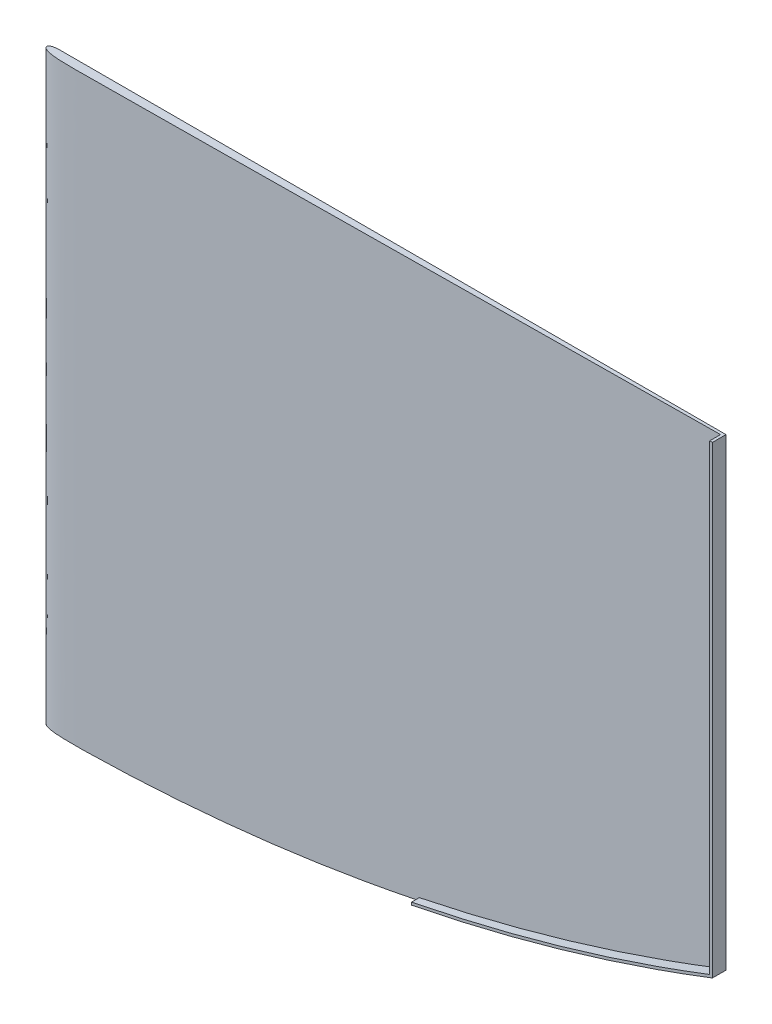
ISO-10303-21;
HEADER;
FILE_DESCRIPTION(('STEP AP214'),'2;1');
FILE_NAME('part.step','',(''),(''),'','','');
FILE_SCHEMA(('AUTOMOTIVE_DESIGN { 1 0 10303 214 1 1 1 1 }'));
ENDSEC;
DATA;
#1=APPLICATION_CONTEXT('core data for automotive mechanical design processes');
#2=APPLICATION_PROTOCOL_DEFINITION('international standard','automotive_design',2000,#1);
#3=PRODUCT_CONTEXT('',#1,'mechanical');
#4=PRODUCT('Part','Part','',(#3));
#5=PRODUCT_RELATED_PRODUCT_CATEGORY('part','',(#4));
#6=PRODUCT_DEFINITION_FORMATION('','',#4);
#7=PRODUCT_DEFINITION_CONTEXT('part definition',#1,'design');
#8=PRODUCT_DEFINITION('design','',#6,#7);
#9=PRODUCT_DEFINITION_SHAPE('','',#8);
#10=(LENGTH_UNIT() NAMED_UNIT(*) SI_UNIT(.MILLI.,.METRE.));
#11=(NAMED_UNIT(*) PLANE_ANGLE_UNIT() SI_UNIT($,.RADIAN.));
#12=(NAMED_UNIT(*) SI_UNIT($,.STERADIAN.) SOLID_ANGLE_UNIT());
#13=UNCERTAINTY_MEASURE_WITH_UNIT(LENGTH_MEASURE(1.E-05),#10,'distance_accuracy_value','');
#14=(GEOMETRIC_REPRESENTATION_CONTEXT(3) GLOBAL_UNCERTAINTY_ASSIGNED_CONTEXT((#13)) GLOBAL_UNIT_ASSIGNED_CONTEXT((#10,
#11,#12)) REPRESENTATION_CONTEXT('',''));
#15=CARTESIAN_POINT('',(0.,0.,0.));
#16=DIRECTION('',(0.,0.,1.));
#17=DIRECTION('',(1.,0.,0.));
#18=AXIS2_PLACEMENT_3D('',#15,#16,#17);
#19=CARTESIAN_POINT('',(10.,325.,0.46764330691438));
#20=CARTESIAN_POINT('',(2.71621760884499,325.,0.46764330691438));
#21=CARTESIAN_POINT('',(-3.97735864607499,325.,4.21726246693246));
#22=CARTESIAN_POINT('',(9.87652859379078,325.,12.2675568358497));
#23=CARTESIAN_POINT('',(65.8357509453584,325.,10.4516996092771));
#24=CARTESIAN_POINT('',(750.000000000002,325.,3.46764330691435));
#25=B_SPLINE_CURVE_WITH_KNOTS('',3,(#19,#20,#21,#22,#23,#24),.UNSPECIFIED.,.F.,.F.,(4,1,1,4),
(0.,0.344535257627006,0.623371844664344,1.),.UNSPECIFIED.);
#26=DIRECTION('',(0.,-1.,0.));
#27=VECTOR('',#26,1.);
#28=SURFACE_OF_LINEAR_EXTRUSION('',#25,#27);
#29=CARTESIAN_POINT('',(415.998579588873,-284.00921309762,6.93854722127019));
#30=CARTESIAN_POINT('',(425.417813856949,-282.144036478102,6.83885819219785));
#31=CARTESIAN_POINT('',(434.823488249002,-280.210376323182,6.73946279469724));
#32=CARTESIAN_POINT('',(453.596060987363,-276.208698371215,6.54138539036173));
#33=CARTESIAN_POINT('',(462.962989353129,-274.140821432531,6.44270275264504));
#34=CARTESIAN_POINT('',(481.658190886952,-269.871219995788,6.24605184077392));
#35=CARTESIAN_POINT('',(490.986489512008,-267.669606985595,6.14808304581763));
#36=CARTESIAN_POINT('',(509.604560268319,-263.133071755132,5.95285563578745));
#37=CARTESIAN_POINT('',(518.894352517353,-260.798232112461,5.85559662204917));
#38=CARTESIAN_POINT('',(537.435537483736,-255.99577139029,5.66178259815729));
#39=CARTESIAN_POINT('',(546.686944244422,-253.528204536924,5.56522731852563));
#40=CARTESIAN_POINT('',(565.151486006363,-248.460816921244,5.37281287232848));
#41=CARTESIAN_POINT('',(574.364628275589,-245.86102264551,5.27695357071304));
#42=CARTESIAN_POINT('',(592.752523606552,-240.529775721392,5.08592473015274));
#43=CARTESIAN_POINT('',(601.927277517865,-237.798326003615,4.99075517590852));
#44=CARTESIAN_POINT('',(620.238814163587,-232.204213208082,4.80109325479693));
#45=CARTESIAN_POINT('',(629.375588486929,-229.341522594885,4.70660103489334));
#46=CARTESIAN_POINT('',(647.611334774014,-223.485431981114,4.51828345693297));
#47=CARTESIAN_POINT('',(656.710289496438,-220.491978286409,4.42445839156537));
#48=CARTESIAN_POINT('',(674.870565916466,-214.374862068707,4.23746463146588));
#49=CARTESIAN_POINT('',(683.931860997545,-211.251120519769,4.14429637637516));
#50=CARTESIAN_POINT('',(702.016981757264,-204.873918796261,3.95860578360579));
#51=CARTESIAN_POINT('',(711.040770942007,-201.620355124789,3.86608403328144));
#52=CARTESIAN_POINT('',(729.051060930541,-194.984014928669,3.68167589574503));
#53=CARTESIAN_POINT('',(738.037514929501,-191.60111135411,3.58979024371872));
#54=CARTESIAN_POINT('',(747.000000032674,-188.155881964508,3.49827236585017));
#55=B_SPLINE_CURVE_WITH_KNOTS('',3,(#29,#30,#31,#32,#33,#34,#35,#36,#37,#38,#39,#40,#41,#42,#43,
#44,#45,#46,#47,#48,#49,#50,#51,#52,#53,#54),.UNSPECIFIED.,.F.,.F.,(4,2,2,2,2,2,2,2,2,2,2,2,4),
(0.,28.8076790939159,57.5855991200083,86.3398494503766,115.076466711799,143.801431415189,
172.520664687382,201.239258973596,229.963906485863,258.700461915227,287.454708429981,
316.232355299303,345.039035654405),.UNSPECIFIED.);
#56=CARTESIAN_POINT('',(415.998579588873,-284.00921309762,6.93854722127019));
#57=VERTEX_POINT('',#56);
#58=CARTESIAN_POINT('',(747.000000000002,-188.155881959906,3.49827236618377));
#59=VERTEX_POINT('',#58);
#60=EDGE_CURVE('E123',#57,#59,#55,.T.);
#61=ORIENTED_EDGE('',*,*,#60,.T.);
#62=DIRECTION('',(0.,-1.,0.));
#63=VECTOR('',#62,1.);
#64=CARTESIAN_POINT('',(747.000000000002,325.,3.49827236618377));
#65=LINE('',#64,#63);
#66=CARTESIAN_POINT('',(746.999999988106,325.,3.49827236630525));
#67=VERTEX_POINT('',#66);
#68=EDGE_CURVE('E54',#67,#59,#65,.T.);
#69=ORIENTED_EDGE('',*,*,#68,.F.);
#70=CARTESIAN_POINT('',(10.,325.,0.46764330691438));
#71=VERTEX_POINT('',#70);
#72=EDGE_CURVE('E279',#71,#67,#25,.T.);
#73=ORIENTED_EDGE('',*,*,#72,.F.);
#74=DIRECTION('',(0.,-1.,0.));
#75=VECTOR('',#74,1.);
#76=CARTESIAN_POINT('',(10.,325.,0.46764330691438));
#77=LINE('',#76,#75);
#78=CARTESIAN_POINT('',(10.,-325.,0.46764330691438));
#79=VERTEX_POINT('',#78);
#80=EDGE_CURVE('E285',#71,#79,#77,.T.);
#81=ORIENTED_EDGE('',*,*,#80,.T.);
#82=CARTESIAN_POINT('',(10.,-325.,0.46764330691438));
#83=CARTESIAN_POINT('',(2.71621760884499,-325.,0.46764330691438));
#84=CARTESIAN_POINT('',(-3.97735864607499,-325.,4.21726246693246));
#85=CARTESIAN_POINT('',(9.87652859379078,-325.,12.2675568358497));
#86=CARTESIAN_POINT('',(65.8357509453584,-325.,10.4516996092771));
#87=CARTESIAN_POINT('',(750.000000000002,-325.,3.46764330691435));
#88=B_SPLINE_CURVE_WITH_KNOTS('',3,(#82,#83,#84,#85,#86,#87),.UNSPECIFIED.,.F.,.F.,(4,1,1,4),
(0.,0.344535257627006,0.623371844664344,1.),.UNSPECIFIED.);
#89=CARTESIAN_POINT('',(-0.15614988924536,-325.,4.23056836880614));
#90=VERTEX_POINT('',#89);
#91=EDGE_CURVE('E293',#79,#90,#88,.T.);
#92=ORIENTED_EDGE('',*,*,#91,.T.);
#93=CARTESIAN_POINT('',(46.9250112812236,-325.,10.6638063402243));
#94=VERTEX_POINT('',#93);
#95=EDGE_CURVE('E292',#90,#94,#88,.T.);
#96=ORIENTED_EDGE('',*,*,#95,.T.);
#97=CARTESIAN_POINT('',(46.9250112714861,-325.,10.6638063402571));
#98=CARTESIAN_POINT('',(48.4920286301361,-324.982394340852,10.6584804391421));
#99=CARTESIAN_POINT('',(50.0590214489743,-324.963023181662,10.6519767038865));
#100=CARTESIAN_POINT('',(53.1929498190023,-324.920745643987,10.6370975558704));
#101=CARTESIAN_POINT('',(54.7598853702205,-324.897839267273,10.6287221440474));
#102=CARTESIAN_POINT('',(57.8936441543706,-324.848487820439,10.6105839076951));
#103=CARTESIAN_POINT('',(59.4604673892772,-324.822042859722,10.6008211260583));
#104=CARTESIAN_POINT('',(62.5940427065563,-324.765609548289,10.5801984325904));
#105=CARTESIAN_POINT('',(64.1607947889183,-324.735621197056,10.5693385205988));
#106=CARTESIAN_POINT('',(68.8608726628726,-324.640336102925,10.5354624299445));
#107=CARTESIAN_POINT('',(71.9940829570532,-324.569718329751,10.5111495128503));
#108=CARTESIAN_POINT('',(78.2601009352993,-324.414261857464,10.4602228626428));
#109=CARTESIAN_POINT('',(81.3929086228833,-324.329423292474,10.4336091512305));
#110=CARTESIAN_POINT('',(87.6589161744335,-324.14546938409,10.3787474800697));
#111=CARTESIAN_POINT('',(90.792115924606,-324.046350289019,10.3504990920415));
#112=CARTESIAN_POINT('',(97.0580503481367,-323.833820855273,10.2928167857794));
#113=CARTESIAN_POINT('',(100.190785016626,-323.720410376265,10.2633828559062));
#114=CARTESIAN_POINT('',(106.455755681653,-323.479267482667,10.2036274383392));
#115=CARTESIAN_POINT('',(109.587991667412,-323.351534791999,10.1733059335446));
#116=CARTESIAN_POINT('',(115.851927280637,-323.081717548398,10.1119846306839));
#117=CARTESIAN_POINT('',(118.983626890054,-322.93963258219,10.0809848131059));
#118=CARTESIAN_POINT('',(127.140259700305,-322.550802463804,9.99955728544947));
#119=CARTESIAN_POINT('',(132.164654653636,-322.292732638489,9.94871920660107));
#120=CARTESIAN_POINT('',(142.211395775251,-321.739463247906,9.84613639037336));
#121=CARTESIAN_POINT('',(147.233741935393,-321.4442635365,9.79439164942619));
#122=CARTESIAN_POINT('',(162.298128731967,-320.502767494516,9.6382321021987));
#123=CARTESIAN_POINT('',(172.336731077416,-319.800611717719,9.53289992676615));
#124=CARTESIAN_POINT('',(192.402835557896,-318.246629955968,9.32112610038324));
#125=CARTESIAN_POINT('',(202.430337068085,-317.394795938077,9.21468439017489));
#126=CARTESIAN_POINT('',(222.471696613436,-315.540900977592,9.00136572654751));
#127=CARTESIAN_POINT('',(232.485554315508,-314.538836431428,8.89448876274793));
#128=CARTESIAN_POINT('',(252.49702277609,-312.384073502198,8.68070408220104));
#129=CARTESIAN_POINT('',(262.494633577527,-311.231375517786,8.57379636553586));
#130=CARTESIAN_POINT('',(282.475727070061,-308.774509513552,8.36014649122991));
#131=CARTESIAN_POINT('',(292.459201542678,-307.470274633736,8.25340442788633));
#132=CARTESIAN_POINT('',(312.405043654994,-304.710619275397,8.04029443508885));
#133=CARTESIAN_POINT('',(322.367411695664,-303.255201695739,7.93392649850164));
#134=CARTESIAN_POINT('',(342.26877702119,-300.193164699446,7.72167084571377));
#135=CARTESIAN_POINT('',(352.207774565931,-298.586546972413,7.61578312416075));
#136=CARTESIAN_POINT('',(372.060153738323,-295.222227476892,7.40456177983898));
#137=CARTESIAN_POINT('',(381.973535410381,-293.464525970502,7.29922815610934));
#138=CARTESIAN_POINT('',(401.77246698976,-289.798288752117,7.08916799315594));
#139=CARTESIAN_POINT('',(411.658016660442,-287.889751761647,6.98444145908593));
#140=CARTESIAN_POINT('',(430.858268182498,-284.030922285169,6.78135510208745));
#141=CARTESIAN_POINT('',(440.174580951991,-282.088641990211,6.68296073021432));
#142=CARTESIAN_POINT('',(458.778487600473,-278.070114637262,6.48677545711067));
#143=CARTESIAN_POINT('',(468.066080861296,-275.99386471642,6.38898456882517));
#144=CARTESIAN_POINT('',(486.610642724918,-271.707962668568,6.19402752431056));
#145=CARTESIAN_POINT('',(495.867610690528,-269.498307784126,6.09686138104067));
#146=CARTESIAN_POINT('',(514.349050294268,-264.946269300759,5.9031712137308));
#147=CARTESIAN_POINT('',(523.57352130084,-262.60388313724,5.8066472021382));
#148=CARTESIAN_POINT('',(541.988120361369,-257.787165322885,5.61425597671273));
#149=CARTESIAN_POINT('',(551.178247836472,-255.312831458731,5.51838877392777));
#150=CARTESIAN_POINT('',(569.522340504526,-250.233110205487,5.32732384146464));
#151=CARTESIAN_POINT('',(578.67630524452,-247.627721180445,5.23212612016048));
#152=CARTESIAN_POINT('',(596.945933309525,-242.286990904278,5.04241495265604));
#153=CARTESIAN_POINT('',(606.061597850404,-239.551653812904,4.94790148466369));
#154=CARTESIAN_POINT('',(624.253203052854,-233.952045159938,4.75956534517915));
#155=CARTESIAN_POINT('',(633.329143875659,-231.087774122209,4.66574267088204));
#156=CARTESIAN_POINT('',(651.439590986535,-225.231501904938,4.47879711169587));
#157=CARTESIAN_POINT('',(660.474097831903,-222.239502448988,4.38567421738378));
#158=CARTESIAN_POINT('',(678.500001871966,-216.129080250428,4.20013650207328));
#159=CARTESIAN_POINT('',(687.49140017075,-213.010660765221,4.10772166290363));
#160=CARTESIAN_POINT('',(705.429441010396,-206.64879979047,3.92360784642852));
#161=CARTESIAN_POINT('',(714.376085385429,-203.405363472777,3.83190883969794));
#162=CARTESIAN_POINT('',(732.223023250498,-196.794987939816,3.64923386795035));
#163=CARTESIAN_POINT('',(741.123319520033,-193.428056230292,3.55825785939884));
#164=CARTESIAN_POINT('',(750.000000000002,-190.,3.46764330691435));
#165=B_SPLINE_CURVE_WITH_KNOTS('',3,(#97,#98,#99,#100,#101,#102,#103,#104,#105,#106,#107,#108,
#109,#110,#111,#112,#113,#114,#115,#116,#117,#118,#119,#120,#121,#122,#123,#124,#125,#126,#127,
#128,#129,#130,#131,#132,#133,#134,#135,#136,#137,#138,#139,#140,#141,#142,#143,#144,#145,#146,
#147,#148,#149,#150,#151,#152,#153,#154,#155,#156,#157,#158,#159,#160,#161,#162,#163,#164),
.UNSPECIFIED.,.F.,.F.,(4,2,2,2,2,2,2,2,2,2,2,2,2,2,2,2,2,2,2,2,2,2,2,2,2,2,2,2,2,2,2,2,2,4),(0.,
4.70137345582646,9.40274455682551,14.1039703401984,18.8051968109248,28.2074611001891,
37.6096367175894,47.0142869255293,56.4190294891209,65.8239533714358,75.2291481463976,
90.3228197325352,105.416550727582,135.606375102656,165.797820201451,195.989989616306,
226.182079128585,256.387540723112,286.592423247561,316.796968284754,347.001460924952,
377.206209604779,405.756631772842,434.307664248365,462.859287065645,491.411461737246,
519.964115499313,548.517125770562,577.06922265048,605.621203532963,634.172799251245,
662.723659761596,691.273340409914,719.821288745137),.UNSPECIFIED.);
#166=CARTESIAN_POINT('',(415.998579589069,-287.009213099258,6.93854722126815));
#167=VERTEX_POINT('',#166);
#168=EDGE_CURVE('E221',#94,#167,#165,.T.);
#169=ORIENTED_EDGE('',*,*,#168,.T.);
#170=DIRECTION('',(0.,-1.,0.));
#171=VECTOR('',#170,1.);
#172=CARTESIAN_POINT('',(415.99857958887,325.,6.93854722127023));
#173=LINE('',#172,#171);
#174=EDGE_CURVE('E209',#57,#167,#173,.T.);
#175=ORIENTED_EDGE('',*,*,#174,.F.);
#176=EDGE_LOOP('',(#61,#69,#73,#81,#92,#96,#169,#175));
#177=FACE_BOUND('',#176,.T.);
#178=ADVANCED_FACE('F37',(#177),#28,.F.);
#179=CARTESIAN_POINT('',(747.000000000002,325.,0.465643306914379));
#180=DIRECTION('',(-1.,0.,0.));
#181=DIRECTION('',(0.,-1.,0.));
#182=AXIS2_PLACEMENT_3D('',#179,#180,#181);
#183=PLANE('',#182);
#184=ORIENTED_EDGE('',*,*,#68,.T.);
#185=DIRECTION('',(0.,0.,1.));
#186=VECTOR('',#185,1.);
#187=CARTESIAN_POINT('',(747.000000044554,-188.155881959905,-25.2653474565868));
#188=LINE('',#187,#186);
#189=CARTESIAN_POINT('',(747.000000044554,-188.155881959905,15.4676433069144));
#190=VERTEX_POINT('',#189);
#191=EDGE_CURVE('E128',#59,#190,#188,.T.);
#192=ORIENTED_EDGE('',*,*,#191,.T.);
#193=DIRECTION('',(0.,-1.,0.));
#194=VECTOR('',#193,1.);
#195=CARTESIAN_POINT('',(747.000000000002,325.,15.4676433069144));
#196=LINE('',#195,#194);
#197=CARTESIAN_POINT('',(747.000000000002,325.,15.4676433069144));
#198=VERTEX_POINT('',#197);
#199=EDGE_CURVE('E138',#198,#190,#196,.T.);
#200=ORIENTED_EDGE('',*,*,#199,.F.);
#201=DIRECTION('',(0.,0.,1.));
#202=VECTOR('',#201,1.);
#203=CARTESIAN_POINT('',(747.000000000002,325.,0.465643306914379));
#204=LINE('',#203,#202);
#205=EDGE_CURVE('E218',#67,#198,#204,.T.);
#206=ORIENTED_EDGE('',*,*,#205,.F.);
#207=EDGE_LOOP('',(#184,#192,#200,#206));
#208=FACE_BOUND('',#207,.T.);
#209=ADVANCED_FACE('F217',(#208),#183,.T.);
#210=CARTESIAN_POINT('',(750.,325.,0.46764330691438));
#211=DIRECTION('',(-1.,0.,0.));
#212=DIRECTION('',(0.,0.,1.));
#213=AXIS2_PLACEMENT_3D('',#210,#211,#212);
#214=PLANE('',#213);
#215=DIRECTION('',(0.,0.,-1.));
#216=VECTOR('',#215,1.);
#217=CARTESIAN_POINT('',(750.,325.,0.46764330691438));
#218=LINE('',#217,#216);
#219=CARTESIAN_POINT('',(750.000000000002,325.,15.4676433069144));
#220=VERTEX_POINT('',#219);
#221=CARTESIAN_POINT('',(750.,325.,0.46764330691438));
#222=VERTEX_POINT('',#221);
#223=EDGE_CURVE('E298',#220,#222,#218,.T.);
#224=ORIENTED_EDGE('',*,*,#223,.F.);
#225=DIRECTION('',(0.,-1.,0.));
#226=VECTOR('',#225,1.);
#227=CARTESIAN_POINT('',(750.000000000002,325.,15.4676433069144));
#228=LINE('',#227,#226);
#229=CARTESIAN_POINT('',(750.000000000002,-190.,15.4676433069144));
#230=VERTEX_POINT('',#229);
#231=EDGE_CURVE('E419',#220,#230,#228,.T.);
#232=ORIENTED_EDGE('',*,*,#231,.T.);
#233=DIRECTION('',(0.,0.,1.));
#234=VECTOR('',#233,1.);
#235=CARTESIAN_POINT('',(750.000000000002,-190.,0.465643306914379));
#236=LINE('',#235,#234);
#237=CARTESIAN_POINT('',(750.000000000002,-190.,3.46764330691435));
#238=VERTEX_POINT('',#237);
#239=EDGE_CURVE('E417',#238,#230,#236,.T.);
#240=ORIENTED_EDGE('',*,*,#239,.F.);
#241=DIRECTION('',(0.,0.,-1.));
#242=VECTOR('',#241,1.);
#243=CARTESIAN_POINT('',(750.000000000002,-190.,1241.7072502727));
#244=LINE('',#243,#242);
#245=CARTESIAN_POINT('',(750.,-190.,0.46764330691438));
#246=VERTEX_POINT('',#245);
#247=EDGE_CURVE('E62',#238,#246,#244,.T.);
#248=ORIENTED_EDGE('',*,*,#247,.T.);
#249=DIRECTION('',(0.,-1.,0.));
#250=VECTOR('',#249,1.);
#251=CARTESIAN_POINT('',(750.,325.,0.46764330691438));
#252=LINE('',#251,#250);
#253=EDGE_CURVE('E46',#222,#246,#252,.T.);
#254=ORIENTED_EDGE('',*,*,#253,.F.);
#255=EDGE_LOOP('',(#224,#232,#240,#248,#254));
#256=FACE_BOUND('',#255,.T.);
#257=ADVANCED_FACE('F39',(#256),#214,.F.);
#258=CARTESIAN_POINT('',(10.,325.,0.46764330691438));
#259=DIRECTION('',(0.,0.,1.));
#260=DIRECTION('',(1.,0.,0.));
#261=AXIS2_PLACEMENT_3D('',#258,#259,#260);
#262=PLANE('',#261);
#263=ORIENTED_EDGE('',*,*,#253,.T.);
#264=CARTESIAN_POINT('',(-0.156149889245851,-325.,0.4676433069144));
#265=CARTESIAN_POINT('',(389.150571819921,-329.354542083934,0.4676433069144));
#266=CARTESIAN_POINT('',(750.000000000002,-190.,0.4676433069144));
#267=B_SPLINE_CURVE_WITH_KNOTS('',2,(#264,#265,#266),.UNSPECIFIED.,.F.,.F.,(3,3),(0.,1.),.UNSPECIFIED.);
#268=CARTESIAN_POINT('',(46.9250112714985,-325.,0.4676433069144));
#269=VERTEX_POINT('',#268);
#270=EDGE_CURVE('E269',#246,#269,#267,.F.);
#271=ORIENTED_EDGE('',*,*,#270,.T.);
#272=DIRECTION('',(-1.,0.,0.));
#273=VECTOR('',#272,1.);
#274=CARTESIAN_POINT('',(10.,-325.,0.46764330691438));
#275=LINE('',#274,#273);
#276=EDGE_CURVE('E287',#269,#79,#275,.T.);
#277=ORIENTED_EDGE('',*,*,#276,.T.);
#278=ORIENTED_EDGE('',*,*,#80,.F.);
#279=DIRECTION('',(-1.,0.,0.));
#280=VECTOR('',#279,1.);
#281=CARTESIAN_POINT('',(10.,325.,0.46764330691438));
#282=LINE('',#281,#280);
#283=EDGE_CURVE('E286',#222,#71,#282,.T.);
#284=ORIENTED_EDGE('',*,*,#283,.F.);
#285=EDGE_LOOP('',(#263,#271,#277,#278,#284));
#286=FACE_BOUND('',#285,.T.);
#287=ADVANCED_FACE('F278',(#286),#262,.F.);
#288=CARTESIAN_POINT('',(5.13021399082541,325.,8.30029531681887));
#289=DIRECTION('',(0.,-1.,0.));
#290=DIRECTION('',(0.,0.,-1.));
#291=AXIS2_PLACEMENT_3D('',#288,#289,#290);
#292=PLANE('',#291);
#293=ORIENTED_EDGE('',*,*,#223,.T.);
#294=ORIENTED_EDGE('',*,*,#283,.T.);
#295=ORIENTED_EDGE('',*,*,#72,.T.);
#296=ORIENTED_EDGE('',*,*,#205,.T.);
#297=DIRECTION('',(-1.,0.,0.));
#298=VECTOR('',#297,1.);
#299=CARTESIAN_POINT('',(750.000000000002,325.,15.4676433069144));
#300=LINE('',#299,#298);
#301=EDGE_CURVE('E211',#220,#198,#300,.T.);
#302=ORIENTED_EDGE('',*,*,#301,.F.);
#303=EDGE_LOOP('',(#293,#294,#295,#296,#302));
#304=FACE_BOUND('',#303,.T.);
#305=ADVANCED_FACE('F317',(#304),#292,.F.);
#306=CARTESIAN_POINT('',(5.13021399082541,-325.,8.30029531681887));
#307=DIRECTION('',(0.,-1.,0.));
#308=DIRECTION('',(0.,0.,-1.));
#309=AXIS2_PLACEMENT_3D('',#306,#307,#308);
#310=PLANE('',#309);
#311=DIRECTION('',(0.,0.,-1.));
#312=VECTOR('',#311,1.);
#313=CARTESIAN_POINT('',(46.9250112714985,-325.,1241.7072502727));
#314=LINE('',#313,#312);
#315=EDGE_CURVE('E11',#94,#269,#314,.T.);
#316=ORIENTED_EDGE('',*,*,#315,.F.);
#317=ORIENTED_EDGE('',*,*,#95,.F.);
#318=ORIENTED_EDGE('',*,*,#91,.F.);
#319=ORIENTED_EDGE('',*,*,#276,.F.);
#320=EDGE_LOOP('',(#316,#317,#318,#319));
#321=FACE_BOUND('',#320,.T.);
#322=ADVANCED_FACE('F277',(#321),#310,.T.);
#323=CARTESIAN_POINT('',(-0.156149889245851,-325.,1241.7072502727));
#324=CARTESIAN_POINT('',(389.150571819921,-329.354542083934,1241.7072502727));
#325=CARTESIAN_POINT('',(750.000000000002,-190.,1241.7072502727));
#326=B_SPLINE_CURVE_WITH_KNOTS('',2,(#323,#324,#325),.UNSPECIFIED.,.F.,.F.,(3,3),(0.,1.),.UNSPECIFIED.);
#327=DIRECTION('',(0.,0.,-1.));
#328=VECTOR('',#327,1.);
#329=SURFACE_OF_LINEAR_EXTRUSION('',#326,#328);
#330=ORIENTED_EDGE('',*,*,#270,.F.);
#331=ORIENTED_EDGE('',*,*,#247,.F.);
#332=CARTESIAN_POINT('',(745.499631392405,-191.731961137145,3.51359410493061));
#333=CARTESIAN_POINT('',(746.250028601426,-191.444173568415,3.50593048794489));
#334=CARTESIAN_POINT('',(747.000257923236,-191.155949689278,3.498269446284));
#335=CARTESIAN_POINT('',(748.500380792437,-190.57862931019,3.4829525136119));
#336=CARTESIAN_POINT('',(749.250274339827,-190.28953281024,3.47529662260068));
#337=CARTESIAN_POINT('',(750.000000000007,-189.999999999882,3.4676433069143));
#338=B_SPLINE_CURVE_WITH_KNOTS('',3,(#332,#333,#334,#335,#336,#337),.UNSPECIFIED.,.F.,.F.,(4,2,
4),(0.,2.41117846338964,4.82235692677929),.UNSPECIFIED.);
#339=CARTESIAN_POINT('',(747.000000044564,-191.155881959902,3.49827236572882));
#340=VERTEX_POINT('',#339);
#341=EDGE_CURVE('E219',#340,#238,#338,.T.);
#342=ORIENTED_EDGE('',*,*,#341,.F.);
#343=CARTESIAN_POINT('',(415.998579588873,-287.009213097663,6.93854722127019));
#344=CARTESIAN_POINT('',(425.417813856937,-285.14403647809,6.83885819219798));
#345=CARTESIAN_POINT('',(434.82348824899,-283.210376323176,6.73946279469736));
#346=CARTESIAN_POINT('',(453.596060987359,-279.208698371249,6.54138539036176));
#347=CARTESIAN_POINT('',(462.962989353133,-277.1408214326,6.44270275264499));
#348=CARTESIAN_POINT('',(481.658190886958,-272.871219995863,6.24605184077387));
#349=CARTESIAN_POINT('',(490.986489512006,-270.66960698564,6.14808304581766));
#350=CARTESIAN_POINT('',(509.604560268316,-266.133071755174,5.95285563578749));
#351=CARTESIAN_POINT('',(518.894352517356,-263.79823211253,5.85559662204913));
#352=CARTESIAN_POINT('',(537.43553748374,-258.995771390363,5.66178259815726));
#353=CARTESIAN_POINT('',(546.686944244419,-256.528204536973,5.56522731852566));
#354=CARTESIAN_POINT('',(565.151486006357,-251.460816921283,5.37281287232854));
#355=CARTESIAN_POINT('',(574.364628275587,-248.861022645561,5.27695357071306));
#356=CARTESIAN_POINT('',(592.752523606543,-243.529775721426,5.08592473015283));
#357=CARTESIAN_POINT('',(601.927277517847,-240.798326003619,4.99075517590871));
#358=CARTESIAN_POINT('',(620.238814163576,-235.204213208111,4.80109325479704));
#359=CARTESIAN_POINT('',(629.375588486935,-232.341522594969,4.70660103489327));
#360=CARTESIAN_POINT('',(647.61133477403,-226.485431981226,4.5182834569328));
#361=CARTESIAN_POINT('',(656.710289496446,-223.491978286496,4.4244583915653));
#362=CARTESIAN_POINT('',(674.870565916466,-217.374862068774,4.23746463146588));
#363=CARTESIAN_POINT('',(683.931860997546,-214.251120519842,4.14429637637514));
#364=CARTESIAN_POINT('',(702.016981757262,-207.873918796326,3.95860578360581));
#365=CARTESIAN_POINT('',(711.040770942001,-204.620355124842,3.86608403328151));
#366=CARTESIAN_POINT('',(729.051060930529,-197.984014928708,3.68167589574515));
#367=CARTESIAN_POINT('',(738.037514929488,-194.601111354147,3.58979024371884));
#368=CARTESIAN_POINT('',(747.000000032667,-191.155881964561,3.49827236585021));
#369=B_SPLINE_CURVE_WITH_KNOTS('',3,(#343,#344,#345,#346,#347,#348,#349,#350,#351,#352,#353,
#354,#355,#356,#357,#358,#359,#360,#361,#362,#363,#364,#365,#366,#367,#368),.UNSPECIFIED.,.F.,
.F.,(4,2,2,2,2,2,2,2,2,2,2,2,4),(0.,28.8076790939139,57.5855991200067,86.3398494503738,
115.076466711795,143.801431415185,172.520664687377,201.239258973589,229.963906485858,
258.700461915221,287.454708429974,316.232355299296,345.039035654396),.UNSPECIFIED.);
#370=EDGE_CURVE('E127',#167,#340,#369,.T.);
#371=ORIENTED_EDGE('',*,*,#370,.F.);
#372=ORIENTED_EDGE('',*,*,#168,.F.);
#373=ORIENTED_EDGE('',*,*,#315,.T.);
#374=EDGE_LOOP('',(#330,#331,#342,#371,#372,#373));
#375=FACE_BOUND('',#374,.T.);
#376=ADVANCED_FACE('F241',(#375),#329,.F.);
#377=CARTESIAN_POINT('',(-255596.504138219,968434.827789122,0.465643306914379));
#378=CARTESIAN_POINT('',(194664.331392445,-981239.3960288,0.465643306914379));
#379=CARTESIAN_POINT('',(-132068.164328317,992895.927416092,0.465643306914379));
#380=B_SPLINE_CURVE_WITH_KNOTS('',2,(#377,#378,#379),.UNSPECIFIED.,.F.,.F.,(3,3),(0.,1.),.UNSPECIFIED.);
#381=DIRECTION('',(0.,0.,1.));
#382=VECTOR('',#381,1.);
#383=SURFACE_OF_LINEAR_EXTRUSION('',#380,#382);
#384=DIRECTION('',(0.,0.,1.));
#385=VECTOR('',#384,1.);
#386=CARTESIAN_POINT('',(747.000000044517,-191.155881959741,0.465643306914379));
#387=LINE('',#386,#385);
#388=CARTESIAN_POINT('',(747.000000044517,-191.155881959741,15.4676433069144));
#389=VERTEX_POINT('',#388);
#390=EDGE_CURVE('E249',#340,#389,#387,.T.);
#391=ORIENTED_EDGE('',*,*,#390,.F.);
#392=ORIENTED_EDGE('',*,*,#341,.T.);
#393=ORIENTED_EDGE('',*,*,#239,.T.);
#394=CARTESIAN_POINT('',(-255596.504138219,968434.827789122,15.4676433069144));
#395=CARTESIAN_POINT('',(194664.331392445,-981239.3960288,15.4676433069144));
#396=CARTESIAN_POINT('',(-132068.164328317,992895.927416092,15.4676433069144));
#397=B_SPLINE_CURVE_WITH_KNOTS('',2,(#394,#395,#396),.UNSPECIFIED.,.F.,.F.,(3,3),(0.,1.),.UNSPECIFIED.);
#398=EDGE_CURVE('E416',#389,#230,#397,.T.);
#399=ORIENTED_EDGE('',*,*,#398,.F.);
#400=EDGE_LOOP('',(#391,#392,#393,#399));
#401=FACE_BOUND('',#400,.T.);
#402=ADVANCED_FACE('F235',(#401),#383,.T.);
#403=CARTESIAN_POINT('',(415.998579588916,-287.009213096553,15.4676433069144));
#404=DIRECTION('',(0.,0.,-1.));
#405=DIRECTION('',(-1.,0.,0.));
#406=AXIS2_PLACEMENT_3D('',#403,#404,#405);
#407=PLANE('',#406);
#408=ORIENTED_EDGE('',*,*,#301,.T.);
#409=ORIENTED_EDGE('',*,*,#199,.T.);
#410=CARTESIAN_POINT('',(-255596.504137389,968437.827789285,15.4676433069144));
#411=CARTESIAN_POINT('',(194664.331392442,-981236.396028802,15.4676433069144));
#412=CARTESIAN_POINT('',(-132068.164329139,992898.927415928,15.4676433069144));
#413=B_SPLINE_CURVE_WITH_KNOTS('',2,(#410,#411,#412),.UNSPECIFIED.,.F.,.F.,(3,3),(0.,1.),.UNSPECIFIED.);
#414=CARTESIAN_POINT('',(415.99857958887,-284.009213097575,15.4676433069144));
#415=VERTEX_POINT('',#414);
#416=EDGE_CURVE('E121',#415,#190,#413,.T.);
#417=ORIENTED_EDGE('',*,*,#416,.F.);
#418=DIRECTION('',(0.,-1.,0.));
#419=VECTOR('',#418,1.);
#420=CARTESIAN_POINT('',(415.99857958887,0.,15.4676433069144));
#421=LINE('',#420,#419);
#422=CARTESIAN_POINT('',(415.99857958887,-287.009213097575,15.4676433069144));
#423=VERTEX_POINT('',#422);
#424=EDGE_CURVE('E135',#415,#423,#421,.T.);
#425=ORIENTED_EDGE('',*,*,#424,.T.);
#426=CARTESIAN_POINT('',(-255596.504137399,968434.827789283,15.4676433069144));
#427=CARTESIAN_POINT('',(194664.331392444,-981239.396028801,15.4676433069144));
#428=CARTESIAN_POINT('',(-132068.164329134,992895.927415929,15.4676433069144));
#429=B_SPLINE_CURVE_WITH_KNOTS('',2,(#426,#427,#428),.UNSPECIFIED.,.F.,.F.,(3,3),(0.,1.),.UNSPECIFIED.);
#430=EDGE_CURVE('E139',#423,#389,#429,.T.);
#431=ORIENTED_EDGE('',*,*,#430,.T.);
#432=ORIENTED_EDGE('',*,*,#398,.T.);
#433=ORIENTED_EDGE('',*,*,#231,.F.);
#434=EDGE_LOOP('',(#408,#409,#417,#425,#431,#432,#433));
#435=FACE_BOUND('',#434,.T.);
#436=ADVANCED_FACE('F134',(#435),#407,.F.);
#437=CARTESIAN_POINT('',(-255596.504137399,968434.827789283,-25.2653474565868));
#438=CARTESIAN_POINT('',(194664.331392444,-981239.396028801,-25.2653474565868));
#439=CARTESIAN_POINT('',(-132068.164329134,992895.927415929,-25.2653474565868));
#440=B_SPLINE_CURVE_WITH_KNOTS('',2,(#437,#438,#439),.UNSPECIFIED.,.F.,.F.,(3,3),(0.,1.),.UNSPECIFIED.);
#441=DIRECTION('',(0.,0.,1.));
#442=VECTOR('',#441,1.);
#443=SURFACE_OF_LINEAR_EXTRUSION('',#440,#442);
#444=DIRECTION('',(0.,0.,1.));
#445=VECTOR('',#444,1.);
#446=CARTESIAN_POINT('',(415.99857958887,-287.009213097575,-25.2653474565868));
#447=LINE('',#446,#445);
#448=EDGE_CURVE('E143',#167,#423,#447,.T.);
#449=ORIENTED_EDGE('',*,*,#448,.F.);
#450=ORIENTED_EDGE('',*,*,#370,.T.);
#451=ORIENTED_EDGE('',*,*,#390,.T.);
#452=ORIENTED_EDGE('',*,*,#430,.F.);
#453=EDGE_LOOP('',(#449,#450,#451,#452));
#454=FACE_BOUND('',#453,.T.);
#455=ADVANCED_FACE('F175',(#454),#443,.T.);
#456=CARTESIAN_POINT('',(-255596.504137389,968437.827789285,-25.2653474565868));
#457=CARTESIAN_POINT('',(194664.331392442,-981236.396028802,-25.2653474565868));
#458=CARTESIAN_POINT('',(-132068.164329139,992898.927415928,-25.2653474565868));
#459=B_SPLINE_CURVE_WITH_KNOTS('',2,(#456,#457,#458),.UNSPECIFIED.,.F.,.F.,(3,3),(0.,1.),.UNSPECIFIED.);
#460=DIRECTION('',(0.,0.,1.));
#461=VECTOR('',#460,1.);
#462=SURFACE_OF_LINEAR_EXTRUSION('',#459,#461);
#463=ORIENTED_EDGE('',*,*,#60,.F.);
#464=DIRECTION('',(0.,0.,1.));
#465=VECTOR('',#464,1.);
#466=CARTESIAN_POINT('',(415.99857958887,-284.009213097575,-25.2653474565868));
#467=LINE('',#466,#465);
#468=EDGE_CURVE('E118',#57,#415,#467,.T.);
#469=ORIENTED_EDGE('',*,*,#468,.T.);
#470=ORIENTED_EDGE('',*,*,#416,.T.);
#471=ORIENTED_EDGE('',*,*,#191,.F.);
#472=EDGE_LOOP('',(#463,#469,#470,#471));
#473=FACE_BOUND('',#472,.T.);
#474=ADVANCED_FACE('F120',(#473),#462,.F.);
#475=CARTESIAN_POINT('',(415.99857958887,0.,-25.2653474565868));
#476=DIRECTION('',(-1.,0.,0.));
#477=DIRECTION('',(0.,0.,1.));
#478=AXIS2_PLACEMENT_3D('',#475,#476,#477);
#479=PLANE('',#478);
#480=ORIENTED_EDGE('',*,*,#468,.F.);
#481=ORIENTED_EDGE('',*,*,#174,.T.);
#482=ORIENTED_EDGE('',*,*,#448,.T.);
#483=ORIENTED_EDGE('',*,*,#424,.F.);
#484=EDGE_LOOP('',(#480,#481,#482,#483));
#485=FACE_BOUND('',#484,.T.);
#486=ADVANCED_FACE('F141',(#485),#479,.T.);
#487=CLOSED_SHELL('',(#178,#209,#257,#287,#305,#322,#376,#402,#436,#455,#474,#486));
#488=MANIFOLD_SOLID_BREP('B2',#487);
#489=ADVANCED_BREP_SHAPE_REPRESENTATION('',(#18,#488),#14);
#490=SHAPE_DEFINITION_REPRESENTATION(#9,#489);
ENDSEC;
END-ISO-10303-21;
